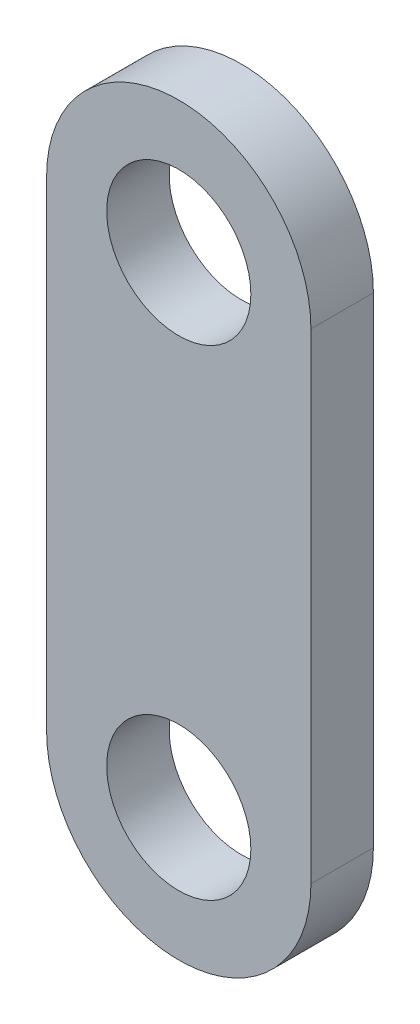
ISO-10303-21;
HEADER;
FILE_DESCRIPTION(('STEP AP214'),'2;1');
FILE_NAME('part.step','',(''),(''),'','','');
FILE_SCHEMA(('AUTOMOTIVE_DESIGN { 1 0 10303 214 1 1 1 1 }'));
ENDSEC;
DATA;
#1=APPLICATION_CONTEXT('core data for automotive mechanical design processes');
#2=APPLICATION_PROTOCOL_DEFINITION('international standard','automotive_design',2000,#1);
#3=PRODUCT_CONTEXT('',#1,'mechanical');
#4=PRODUCT('Part','Part','',(#3));
#5=PRODUCT_RELATED_PRODUCT_CATEGORY('part','',(#4));
#6=PRODUCT_DEFINITION_FORMATION('','',#4);
#7=PRODUCT_DEFINITION_CONTEXT('part definition',#1,'design');
#8=PRODUCT_DEFINITION('design','',#6,#7);
#9=PRODUCT_DEFINITION_SHAPE('','',#8);
#10=(LENGTH_UNIT() NAMED_UNIT(*) SI_UNIT(.MILLI.,.METRE.));
#11=(NAMED_UNIT(*) PLANE_ANGLE_UNIT() SI_UNIT($,.RADIAN.));
#12=(NAMED_UNIT(*) SI_UNIT($,.STERADIAN.) SOLID_ANGLE_UNIT());
#13=UNCERTAINTY_MEASURE_WITH_UNIT(LENGTH_MEASURE(1.E-05),#10,'distance_accuracy_value','');
#14=(GEOMETRIC_REPRESENTATION_CONTEXT(3) GLOBAL_UNCERTAINTY_ASSIGNED_CONTEXT((#13)) GLOBAL_UNIT_ASSIGNED_CONTEXT((#10,
#11,#12)) REPRESENTATION_CONTEXT('',''));
#15=CARTESIAN_POINT('',(0.,0.,0.));
#16=DIRECTION('',(0.,0.,1.));
#17=DIRECTION('',(1.,0.,0.));
#18=AXIS2_PLACEMENT_3D('',#15,#16,#17);
#19=CARTESIAN_POINT('',(0.,10.,2.6));
#20=DIRECTION('',(0.,0.,1.));
#21=DIRECTION('',(1.,0.,0.));
#22=AXIS2_PLACEMENT_3D('',#19,#20,#21);
#23=PLANE('',#22);
#24=CARTESIAN_POINT('',(0.,-10.,2.6));
#25=DIRECTION('',(0.,0.,1.));
#26=DIRECTION('',(1.,0.,0.));
#27=AXIS2_PLACEMENT_3D('',#24,#25,#26);
#28=CIRCLE('',#27,3.);
#29=CARTESIAN_POINT('',(3.,-10.,2.6));
#30=VERTEX_POINT('',#29);
#31=EDGE_CURVE('E112',#30,#30,#28,.T.);
#32=ORIENTED_EDGE('',*,*,#31,.F.);
#33=EDGE_LOOP('',(#32));
#34=FACE_BOUND('',#33,.T.);
#35=CARTESIAN_POINT('',(0.,10.,2.6));
#36=DIRECTION('',(0.,0.,1.));
#37=DIRECTION('',(1.,0.,0.));
#38=AXIS2_PLACEMENT_3D('',#35,#36,#37);
#39=CIRCLE('',#38,5.5);
#40=CARTESIAN_POINT('',(5.5,10.,2.6));
#41=VERTEX_POINT('',#40);
#42=CARTESIAN_POINT('',(-5.49999999999999,10.,2.6));
#43=VERTEX_POINT('',#42);
#44=EDGE_CURVE('E92',#41,#43,#39,.T.);
#45=ORIENTED_EDGE('',*,*,#44,.T.);
#46=DIRECTION('',(0.,-1.,0.));
#47=VECTOR('',#46,1.);
#48=CARTESIAN_POINT('',(-5.49999999999999,10.,2.6));
#49=LINE('',#48,#47);
#50=CARTESIAN_POINT('',(-5.5,-10.,2.6));
#51=VERTEX_POINT('',#50);
#52=EDGE_CURVE('E87',#43,#51,#49,.T.);
#53=ORIENTED_EDGE('',*,*,#52,.T.);
#54=CARTESIAN_POINT('',(0.,-10.,2.6));
#55=DIRECTION('',(0.,0.,1.));
#56=DIRECTION('',(1.,0.,0.));
#57=AXIS2_PLACEMENT_3D('',#54,#55,#56);
#58=CIRCLE('',#57,5.5);
#59=CARTESIAN_POINT('',(5.5,-10.,2.6));
#60=VERTEX_POINT('',#59);
#61=EDGE_CURVE('E90',#51,#60,#58,.T.);
#62=ORIENTED_EDGE('',*,*,#61,.T.);
#63=DIRECTION('',(0.,1.,0.));
#64=VECTOR('',#63,1.);
#65=CARTESIAN_POINT('',(5.5,10.,2.6));
#66=LINE('',#65,#64);
#67=EDGE_CURVE('E57',#60,#41,#66,.T.);
#68=ORIENTED_EDGE('',*,*,#67,.T.);
#69=EDGE_LOOP('',(#45,#53,#62,#68));
#70=FACE_BOUND('',#69,.T.);
#71=CARTESIAN_POINT('',(0.,10.,2.6));
#72=DIRECTION('',(0.,0.,1.));
#73=DIRECTION('',(1.,0.,0.));
#74=AXIS2_PLACEMENT_3D('',#71,#72,#73);
#75=CIRCLE('',#74,3.);
#76=CARTESIAN_POINT('',(3.,10.,2.6));
#77=VERTEX_POINT('',#76);
#78=EDGE_CURVE('E134',#77,#77,#75,.T.);
#79=ORIENTED_EDGE('',*,*,#78,.F.);
#80=EDGE_LOOP('',(#79));
#81=FACE_BOUND('',#80,.T.);
#82=ADVANCED_FACE('F39',(#34,#70,#81),#23,.T.);
#83=CARTESIAN_POINT('',(0.,10.,0.));
#84=DIRECTION('',(0.,0.,1.));
#85=DIRECTION('',(1.,0.,0.));
#86=AXIS2_PLACEMENT_3D('',#83,#84,#85);
#87=PLANE('',#86);
#88=CARTESIAN_POINT('',(0.,10.,0.));
#89=DIRECTION('',(0.,0.,1.));
#90=DIRECTION('',(1.,0.,0.));
#91=AXIS2_PLACEMENT_3D('',#88,#89,#90);
#92=CIRCLE('',#91,5.5);
#93=CARTESIAN_POINT('',(5.5,10.,0.));
#94=VERTEX_POINT('',#93);
#95=CARTESIAN_POINT('',(-5.49999999999999,10.,0.));
#96=VERTEX_POINT('',#95);
#97=EDGE_CURVE('E108',#94,#96,#92,.T.);
#98=ORIENTED_EDGE('',*,*,#97,.F.);
#99=DIRECTION('',(0.,1.,0.));
#100=VECTOR('',#99,1.);
#101=CARTESIAN_POINT('',(5.5,10.,0.));
#102=LINE('',#101,#100);
#103=CARTESIAN_POINT('',(5.5,-10.,0.));
#104=VERTEX_POINT('',#103);
#105=EDGE_CURVE('E80',#104,#94,#102,.T.);
#106=ORIENTED_EDGE('',*,*,#105,.F.);
#107=CARTESIAN_POINT('',(0.,-10.,0.));
#108=DIRECTION('',(0.,0.,1.));
#109=DIRECTION('',(1.,0.,0.));
#110=AXIS2_PLACEMENT_3D('',#107,#108,#109);
#111=CIRCLE('',#110,5.5);
#112=CARTESIAN_POINT('',(-5.5,-10.,0.));
#113=VERTEX_POINT('',#112);
#114=EDGE_CURVE('E74',#113,#104,#111,.T.);
#115=ORIENTED_EDGE('',*,*,#114,.F.);
#116=DIRECTION('',(0.,-1.,0.));
#117=VECTOR('',#116,1.);
#118=CARTESIAN_POINT('',(-5.49999999999999,10.,0.));
#119=LINE('',#118,#117);
#120=EDGE_CURVE('E97',#96,#113,#119,.T.);
#121=ORIENTED_EDGE('',*,*,#120,.F.);
#122=EDGE_LOOP('',(#98,#106,#115,#121));
#123=FACE_BOUND('',#122,.T.);
#124=CARTESIAN_POINT('',(0.,-10.,0.));
#125=DIRECTION('',(0.,0.,1.));
#126=DIRECTION('',(1.,0.,0.));
#127=AXIS2_PLACEMENT_3D('',#124,#125,#126);
#128=CIRCLE('',#127,3.);
#129=CARTESIAN_POINT('',(3.,-10.,0.));
#130=VERTEX_POINT('',#129);
#131=EDGE_CURVE('E130',#130,#130,#128,.T.);
#132=ORIENTED_EDGE('',*,*,#131,.T.);
#133=EDGE_LOOP('',(#132));
#134=FACE_BOUND('',#133,.T.);
#135=CARTESIAN_POINT('',(0.,10.,0.));
#136=DIRECTION('',(0.,0.,1.));
#137=DIRECTION('',(1.,0.,0.));
#138=AXIS2_PLACEMENT_3D('',#135,#136,#137);
#139=CIRCLE('',#138,3.);
#140=CARTESIAN_POINT('',(3.,10.,0.));
#141=VERTEX_POINT('',#140);
#142=EDGE_CURVE('E138',#141,#141,#139,.T.);
#143=ORIENTED_EDGE('',*,*,#142,.T.);
#144=EDGE_LOOP('',(#143));
#145=FACE_BOUND('',#144,.T.);
#146=ADVANCED_FACE('F125',(#123,#134,#145),#87,.F.);
#147=CARTESIAN_POINT('',(0.,10.,2.6));
#148=DIRECTION('',(0.,0.,-1.));
#149=DIRECTION('',(-1.,0.,0.));
#150=AXIS2_PLACEMENT_3D('',#147,#148,#149);
#151=CYLINDRICAL_SURFACE('',#150,5.5);
#152=ORIENTED_EDGE('',*,*,#97,.T.);
#153=DIRECTION('',(0.,0.,-1.));
#154=VECTOR('',#153,1.);
#155=CARTESIAN_POINT('',(-5.49999999999999,10.,2.6));
#156=LINE('',#155,#154);
#157=EDGE_CURVE('E11',#43,#96,#156,.T.);
#158=ORIENTED_EDGE('',*,*,#157,.F.);
#159=ORIENTED_EDGE('',*,*,#44,.F.);
#160=DIRECTION('',(0.,0.,-1.));
#161=VECTOR('',#160,1.);
#162=CARTESIAN_POINT('',(5.5,10.,2.6));
#163=LINE('',#162,#161);
#164=EDGE_CURVE('E104',#41,#94,#163,.T.);
#165=ORIENTED_EDGE('',*,*,#164,.T.);
#166=EDGE_LOOP('',(#152,#158,#159,#165));
#167=FACE_BOUND('',#166,.T.);
#168=ADVANCED_FACE('F41',(#167),#151,.T.);
#169=CARTESIAN_POINT('',(-5.49999999999999,10.,2.6));
#170=DIRECTION('',(1.,0.,0.));
#171=DIRECTION('',(0.,0.,-1.));
#172=AXIS2_PLACEMENT_3D('',#169,#170,#171);
#173=PLANE('',#172);
#174=ORIENTED_EDGE('',*,*,#120,.T.);
#175=DIRECTION('',(0.,0.,-1.));
#176=VECTOR('',#175,1.);
#177=CARTESIAN_POINT('',(-5.5,-10.,2.6));
#178=LINE('',#177,#176);
#179=EDGE_CURVE('E49',#51,#113,#178,.T.);
#180=ORIENTED_EDGE('',*,*,#179,.F.);
#181=ORIENTED_EDGE('',*,*,#52,.F.);
#182=ORIENTED_EDGE('',*,*,#157,.T.);
#183=EDGE_LOOP('',(#174,#180,#181,#182));
#184=FACE_BOUND('',#183,.T.);
#185=ADVANCED_FACE('F96',(#184),#173,.F.);
#186=CARTESIAN_POINT('',(0.,-10.,2.6));
#187=DIRECTION('',(0.,0.,-1.));
#188=DIRECTION('',(-1.,0.,0.));
#189=AXIS2_PLACEMENT_3D('',#186,#187,#188);
#190=CYLINDRICAL_SURFACE('',#189,5.5);
#191=ORIENTED_EDGE('',*,*,#114,.T.);
#192=DIRECTION('',(0.,0.,-1.));
#193=VECTOR('',#192,1.);
#194=CARTESIAN_POINT('',(5.5,-10.,2.6));
#195=LINE('',#194,#193);
#196=EDGE_CURVE('E99',#60,#104,#195,.T.);
#197=ORIENTED_EDGE('',*,*,#196,.F.);
#198=ORIENTED_EDGE('',*,*,#61,.F.);
#199=ORIENTED_EDGE('',*,*,#179,.T.);
#200=EDGE_LOOP('',(#191,#197,#198,#199));
#201=FACE_BOUND('',#200,.T.);
#202=ADVANCED_FACE('F100',(#201),#190,.T.);
#203=CARTESIAN_POINT('',(5.5,10.,2.6));
#204=DIRECTION('',(-1.,0.,0.));
#205=DIRECTION('',(0.,0.,1.));
#206=AXIS2_PLACEMENT_3D('',#203,#204,#205);
#207=PLANE('',#206);
#208=ORIENTED_EDGE('',*,*,#105,.T.);
#209=ORIENTED_EDGE('',*,*,#164,.F.);
#210=ORIENTED_EDGE('',*,*,#67,.F.);
#211=ORIENTED_EDGE('',*,*,#196,.T.);
#212=EDGE_LOOP('',(#208,#209,#210,#211));
#213=FACE_BOUND('',#212,.T.);
#214=ADVANCED_FACE('F122',(#213),#207,.F.);
#215=CARTESIAN_POINT('',(0.,-10.,2.6));
#216=DIRECTION('',(0.,0.,-1.));
#217=DIRECTION('',(-1.,0.,0.));
#218=AXIS2_PLACEMENT_3D('',#215,#216,#217);
#219=CYLINDRICAL_SURFACE('',#218,3.);
#220=ORIENTED_EDGE('',*,*,#31,.T.);
#221=EDGE_LOOP('',(#220));
#222=FACE_BOUND('',#221,.T.);
#223=ORIENTED_EDGE('',*,*,#131,.F.);
#224=EDGE_LOOP('',(#223));
#225=FACE_BOUND('',#224,.T.);
#226=ADVANCED_FACE('F157',(#222,#225),#219,.F.);
#227=CARTESIAN_POINT('',(0.,10.,2.6));
#228=DIRECTION('',(0.,0.,-1.));
#229=DIRECTION('',(-1.,0.,0.));
#230=AXIS2_PLACEMENT_3D('',#227,#228,#229);
#231=CYLINDRICAL_SURFACE('',#230,3.);
#232=ORIENTED_EDGE('',*,*,#78,.T.);
#233=EDGE_LOOP('',(#232));
#234=FACE_BOUND('',#233,.T.);
#235=ORIENTED_EDGE('',*,*,#142,.F.);
#236=EDGE_LOOP('',(#235));
#237=FACE_BOUND('',#236,.T.);
#238=ADVANCED_FACE('F146',(#234,#237),#231,.F.);
#239=CLOSED_SHELL('',(#82,#146,#168,#185,#202,#214,#226,#238));
#240=MANIFOLD_SOLID_BREP('B2',#239);
#241=ADVANCED_BREP_SHAPE_REPRESENTATION('',(#18,#240),#14);
#242=SHAPE_DEFINITION_REPRESENTATION(#9,#241);
ENDSEC;
END-ISO-10303-21;
